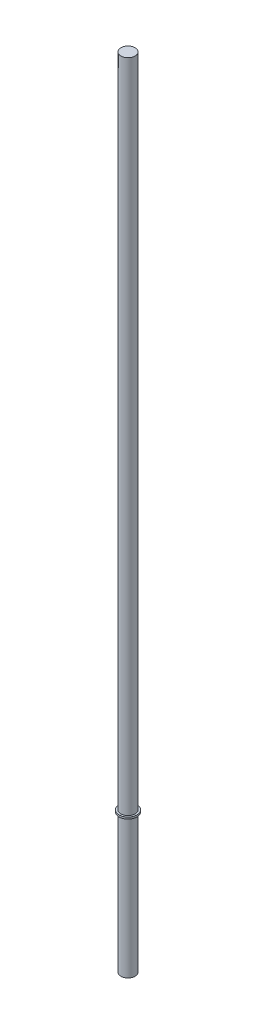
ISO-10303-21;
HEADER;
FILE_DESCRIPTION(('STEP AP214'),'2;1');
FILE_NAME('part.step','',(''),(''),'','','');
FILE_SCHEMA(('AUTOMOTIVE_DESIGN { 1 0 10303 214 1 1 1 1 }'));
ENDSEC;
DATA;
#1=APPLICATION_CONTEXT('core data for automotive mechanical design processes');
#2=APPLICATION_PROTOCOL_DEFINITION('international standard','automotive_design',2000,#1);
#3=PRODUCT_CONTEXT('',#1,'mechanical');
#4=PRODUCT('Part','Part','',(#3));
#5=PRODUCT_RELATED_PRODUCT_CATEGORY('part','',(#4));
#6=PRODUCT_DEFINITION_FORMATION('','',#4);
#7=PRODUCT_DEFINITION_CONTEXT('part definition',#1,'design');
#8=PRODUCT_DEFINITION('design','',#6,#7);
#9=PRODUCT_DEFINITION_SHAPE('','',#8);
#10=(LENGTH_UNIT() NAMED_UNIT(*) SI_UNIT(.MILLI.,.METRE.));
#11=(NAMED_UNIT(*) PLANE_ANGLE_UNIT() SI_UNIT($,.RADIAN.));
#12=(NAMED_UNIT(*) SI_UNIT($,.STERADIAN.) SOLID_ANGLE_UNIT());
#13=UNCERTAINTY_MEASURE_WITH_UNIT(LENGTH_MEASURE(1.E-05),#10,'distance_accuracy_value','');
#14=(GEOMETRIC_REPRESENTATION_CONTEXT(3) GLOBAL_UNCERTAINTY_ASSIGNED_CONTEXT((#13)) GLOBAL_UNIT_ASSIGNED_CONTEXT((#10,
#11,#12)) REPRESENTATION_CONTEXT('',''));
#15=CARTESIAN_POINT('',(0.,0.,0.));
#16=DIRECTION('',(0.,0.,1.));
#17=DIRECTION('',(1.,0.,0.));
#18=AXIS2_PLACEMENT_3D('',#15,#16,#17);
#19=CARTESIAN_POINT('',(0.,445.1,0.));
#20=DIRECTION('',(0.,-1.,0.));
#21=DIRECTION('',(0.,0.,-1.));
#22=AXIS2_PLACEMENT_3D('',#19,#20,#21);
#23=CYLINDRICAL_SURFACE('',#22,4.);
#24=CARTESIAN_POINT('',(0.,78.55,0.));
#25=DIRECTION('',(0.,1.,0.));
#26=DIRECTION('',(0.,0.,1.));
#27=AXIS2_PLACEMENT_3D('',#24,#25,#26);
#28=CIRCLE('',#27,4.);
#29=CARTESIAN_POINT('',(0.,78.55,4.));
#30=VERTEX_POINT('',#29);
#31=EDGE_CURVE('E35',#30,#30,#28,.T.);
#32=ORIENTED_EDGE('',*,*,#31,.T.);
#33=EDGE_LOOP('',(#32));
#34=FACE_BOUND('',#33,.T.);
#35=CARTESIAN_POINT('',(0.,445.1,0.));
#36=DIRECTION('',(0.,1.,0.));
#37=DIRECTION('',(0.,0.,1.));
#38=AXIS2_PLACEMENT_3D('',#35,#36,#37);
#39=CIRCLE('',#38,4.);
#40=CARTESIAN_POINT('',(0.,445.1,4.));
#41=VERTEX_POINT('',#40);
#42=EDGE_CURVE('E10',#41,#41,#39,.T.);
#43=ORIENTED_EDGE('',*,*,#42,.F.);
#44=EDGE_LOOP('',(#43));
#45=FACE_BOUND('',#44,.T.);
#46=ADVANCED_FACE('F31',(#34,#45),#23,.T.);
#47=CARTESIAN_POINT('',(0.,445.1,0.));
#48=DIRECTION('',(0.,1.,0.));
#49=DIRECTION('',(0.,0.,1.));
#50=AXIS2_PLACEMENT_3D('',#47,#48,#49);
#51=PLANE('',#50);
#52=ORIENTED_EDGE('',*,*,#42,.T.);
#53=EDGE_LOOP('',(#52));
#54=FACE_BOUND('',#53,.T.);
#55=ADVANCED_FACE('F73',(#54),#51,.T.);
#56=CARTESIAN_POINT('',(0.,78.55,0.));
#57=DIRECTION('',(0.,1.,0.));
#58=DIRECTION('',(0.,0.,1.));
#59=AXIS2_PLACEMENT_3D('',#56,#57,#58);
#60=PLANE('',#59);
#61=ORIENTED_EDGE('',*,*,#31,.F.);
#62=EDGE_LOOP('',(#61));
#63=FACE_BOUND('',#62,.T.);
#64=CARTESIAN_POINT('',(0.,78.55,0.));
#65=DIRECTION('',(0.,-1.,0.));
#66=DIRECTION('',(0.,0.,-1.));
#67=AXIS2_PLACEMENT_3D('',#64,#65,#66);
#68=CIRCLE('',#67,5.);
#69=CARTESIAN_POINT('',(0.,78.55,-5.));
#70=VERTEX_POINT('',#69);
#71=EDGE_CURVE('E46',#70,#70,#68,.T.);
#72=ORIENTED_EDGE('',*,*,#71,.F.);
#73=EDGE_LOOP('',(#72));
#74=FACE_BOUND('',#73,.T.);
#75=ADVANCED_FACE('F64',(#63,#74),#60,.T.);
#76=CARTESIAN_POINT('',(0.,77.55,0.));
#77=DIRECTION('',(0.,-1.,0.));
#78=DIRECTION('',(0.,0.,-1.));
#79=AXIS2_PLACEMENT_3D('',#76,#77,#78);
#80=CYLINDRICAL_SURFACE('',#79,5.);
#81=ORIENTED_EDGE('',*,*,#71,.T.);
#82=EDGE_LOOP('',(#81));
#83=FACE_BOUND('',#82,.T.);
#84=CARTESIAN_POINT('',(0.,77.55,0.));
#85=DIRECTION('',(0.,-1.,0.));
#86=DIRECTION('',(0.,0.,-1.));
#87=AXIS2_PLACEMENT_3D('',#84,#85,#86);
#88=CIRCLE('',#87,5.);
#89=CARTESIAN_POINT('',(0.,77.55,-5.));
#90=VERTEX_POINT('',#89);
#91=EDGE_CURVE('E54',#90,#90,#88,.T.);
#92=ORIENTED_EDGE('',*,*,#91,.F.);
#93=EDGE_LOOP('',(#92));
#94=FACE_BOUND('',#93,.T.);
#95=ADVANCED_FACE('F62',(#83,#94),#80,.T.);
#96=CARTESIAN_POINT('',(5.,77.55,0.));
#97=DIRECTION('',(0.,-1.,0.));
#98=DIRECTION('',(0.,0.,-1.));
#99=AXIS2_PLACEMENT_3D('',#96,#97,#98);
#100=PLANE('',#99);
#101=CARTESIAN_POINT('',(0.,77.55,0.));
#102=DIRECTION('',(0.,-1.,0.));
#103=DIRECTION('',(0.,0.,-1.));
#104=AXIS2_PLACEMENT_3D('',#101,#102,#103);
#105=CIRCLE('',#104,4.);
#106=CARTESIAN_POINT('',(0.,77.55,-4.));
#107=VERTEX_POINT('',#106);
#108=EDGE_CURVE('E48',#107,#107,#105,.T.);
#109=ORIENTED_EDGE('',*,*,#108,.F.);
#110=EDGE_LOOP('',(#109));
#111=FACE_BOUND('',#110,.T.);
#112=ORIENTED_EDGE('',*,*,#91,.T.);
#113=EDGE_LOOP('',(#112));
#114=FACE_BOUND('',#113,.T.);
#115=ADVANCED_FACE('F60',(#111,#114),#100,.T.);
#116=CARTESIAN_POINT('',(0.,0.,0.));
#117=DIRECTION('',(0.,1.,0.));
#118=DIRECTION('',(0.,0.,1.));
#119=AXIS2_PLACEMENT_3D('',#116,#117,#118);
#120=PLANE('',#119);
#121=CARTESIAN_POINT('',(0.,0.,0.));
#122=DIRECTION('',(0.,1.,0.));
#123=DIRECTION('',(0.,0.,1.));
#124=AXIS2_PLACEMENT_3D('',#121,#122,#123);
#125=CIRCLE('',#124,4.);
#126=CARTESIAN_POINT('',(0.,0.,4.));
#127=VERTEX_POINT('',#126);
#128=EDGE_CURVE('E39',#127,#127,#125,.T.);
#129=ORIENTED_EDGE('',*,*,#128,.F.);
#130=EDGE_LOOP('',(#129));
#131=FACE_BOUND('',#130,.T.);
#132=ADVANCED_FACE('F70',(#131),#120,.F.);
#133=ORIENTED_EDGE('',*,*,#108,.T.);
#134=EDGE_LOOP('',(#133));
#135=FACE_BOUND('',#134,.T.);
#136=ORIENTED_EDGE('',*,*,#128,.T.);
#137=EDGE_LOOP('',(#136));
#138=FACE_BOUND('',#137,.T.);
#139=ADVANCED_FACE('F33',(#135,#138),#23,.T.);
#140=CLOSED_SHELL('',(#46,#55,#75,#95,#115,#132,#139));
#141=MANIFOLD_SOLID_BREP('B2',#140);
#142=ADVANCED_BREP_SHAPE_REPRESENTATION('',(#18,#141),#14);
#143=SHAPE_DEFINITION_REPRESENTATION(#9,#142);
ENDSEC;
END-ISO-10303-21;
